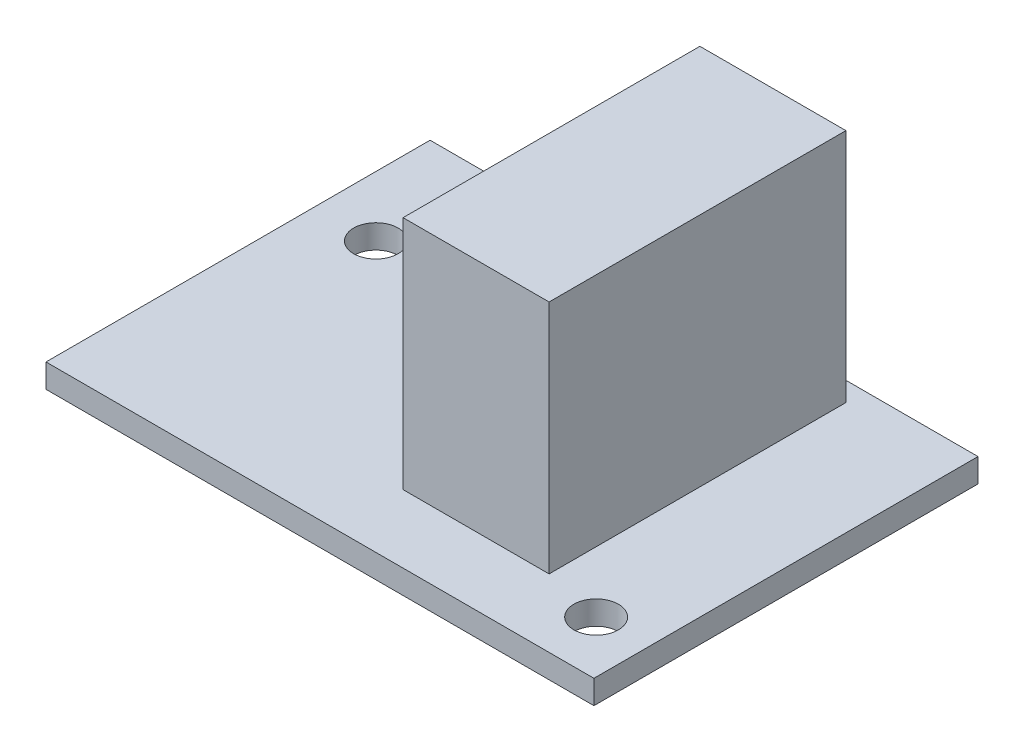
ISO-10303-21;
HEADER;
FILE_DESCRIPTION(('STEP AP214'),'2;1');
FILE_NAME('part.step','',(''),(''),'','','');
FILE_SCHEMA(('AUTOMOTIVE_DESIGN { 1 0 10303 214 1 1 1 1 }'));
ENDSEC;
DATA;
#1=APPLICATION_CONTEXT('core data for automotive mechanical design processes');
#2=APPLICATION_PROTOCOL_DEFINITION('international standard','automotive_design',2000,#1);
#3=PRODUCT_CONTEXT('',#1,'mechanical');
#4=PRODUCT('Part','Part','',(#3));
#5=PRODUCT_RELATED_PRODUCT_CATEGORY('part','',(#4));
#6=PRODUCT_DEFINITION_FORMATION('','',#4);
#7=PRODUCT_DEFINITION_CONTEXT('part definition',#1,'design');
#8=PRODUCT_DEFINITION('design','',#6,#7);
#9=PRODUCT_DEFINITION_SHAPE('','',#8);
#10=(LENGTH_UNIT() NAMED_UNIT(*) SI_UNIT(.MILLI.,.METRE.));
#11=(NAMED_UNIT(*) PLANE_ANGLE_UNIT() SI_UNIT($,.RADIAN.));
#12=(NAMED_UNIT(*) SI_UNIT($,.STERADIAN.) SOLID_ANGLE_UNIT());
#13=UNCERTAINTY_MEASURE_WITH_UNIT(LENGTH_MEASURE(1.E-05),#10,'distance_accuracy_value','');
#14=(GEOMETRIC_REPRESENTATION_CONTEXT(3) GLOBAL_UNCERTAINTY_ASSIGNED_CONTEXT((#13)) GLOBAL_UNIT_ASSIGNED_CONTEXT((#10,
#11,#12)) REPRESENTATION_CONTEXT('',''));
#15=CARTESIAN_POINT('',(0.,0.,0.));
#16=DIRECTION('',(0.,0.,1.));
#17=DIRECTION('',(1.,0.,0.));
#18=AXIS2_PLACEMENT_3D('',#15,#16,#17);
#19=CARTESIAN_POINT('',(0.,1.6,0.));
#20=DIRECTION('',(0.,-1.,0.));
#21=DIRECTION('',(0.,0.,-1.));
#22=AXIS2_PLACEMENT_3D('',#19,#20,#21);
#23=PLANE('',#22);
#24=CARTESIAN_POINT('',(4.05,1.6,-18.18));
#25=DIRECTION('',(0.,1.,0.));
#26=DIRECTION('',(0.,0.,1.));
#27=AXIS2_PLACEMENT_3D('',#24,#25,#26);
#28=CIRCLE('',#27,1.5);
#29=CARTESIAN_POINT('',(4.05,1.6,-16.68));
#30=VERTEX_POINT('',#29);
#31=EDGE_CURVE('E121',#30,#30,#28,.T.);
#32=ORIENTED_EDGE('',*,*,#31,.F.);
#33=EDGE_LOOP('',(#32));
#34=FACE_BOUND('',#33,.T.);
#35=CARTESIAN_POINT('',(33.42,1.6,-3.65));
#36=DIRECTION('',(0.,1.,0.));
#37=DIRECTION('',(0.,0.,1.));
#38=AXIS2_PLACEMENT_3D('',#35,#36,#37);
#39=CIRCLE('',#38,1.5);
#40=CARTESIAN_POINT('',(33.42,1.6,-2.15));
#41=VERTEX_POINT('',#40);
#42=EDGE_CURVE('E130',#41,#41,#39,.T.);
#43=ORIENTED_EDGE('',*,*,#42,.F.);
#44=EDGE_LOOP('',(#43));
#45=FACE_BOUND('',#44,.T.);
#46=DIRECTION('',(0.,0.,1.));
#47=VECTOR('',#46,1.);
#48=CARTESIAN_POINT('',(0.,1.6,0.));
#49=LINE('',#48,#47);
#50=CARTESIAN_POINT('',(0.,1.6,-25.88));
#51=VERTEX_POINT('',#50);
#52=CARTESIAN_POINT('',(0.,1.6,0.));
#53=VERTEX_POINT('',#52);
#54=EDGE_CURVE('E136',#51,#53,#49,.T.);
#55=ORIENTED_EDGE('',*,*,#54,.T.);
#56=DIRECTION('',(1.,0.,0.));
#57=VECTOR('',#56,1.);
#58=CARTESIAN_POINT('',(0.,1.6,0.));
#59=LINE('',#58,#57);
#60=CARTESIAN_POINT('',(36.92,1.6,0.));
#61=VERTEX_POINT('',#60);
#62=EDGE_CURVE('E139',#53,#61,#59,.T.);
#63=ORIENTED_EDGE('',*,*,#62,.T.);
#64=DIRECTION('',(0.,0.,-1.));
#65=VECTOR('',#64,1.);
#66=CARTESIAN_POINT('',(36.92,1.6,0.));
#67=LINE('',#66,#65);
#68=CARTESIAN_POINT('',(36.92,1.6,-25.88));
#69=VERTEX_POINT('',#68);
#70=EDGE_CURVE('E142',#61,#69,#67,.T.);
#71=ORIENTED_EDGE('',*,*,#70,.T.);
#72=DIRECTION('',(-1.,0.,0.));
#73=VECTOR('',#72,1.);
#74=CARTESIAN_POINT('',(0.,1.6,-25.88));
#75=LINE('',#74,#73);
#76=EDGE_CURVE('E144',#69,#51,#75,.T.);
#77=ORIENTED_EDGE('',*,*,#76,.T.);
#78=EDGE_LOOP('',(#55,#63,#71,#77));
#79=FACE_BOUND('',#78,.T.);
#80=DIRECTION('',(0.,0.,1.));
#81=VECTOR('',#80,1.);
#82=CARTESIAN_POINT('',(19.48,1.6,-24.58));
#83=LINE('',#82,#81);
#84=CARTESIAN_POINT('',(19.48,1.6,-24.58));
#85=VERTEX_POINT('',#84);
#86=CARTESIAN_POINT('',(19.48,1.6,-4.58));
#87=VERTEX_POINT('',#86);
#88=EDGE_CURVE('E117',#85,#87,#83,.T.);
#89=ORIENTED_EDGE('',*,*,#88,.F.);
#90=DIRECTION('',(-1.,0.,0.));
#91=VECTOR('',#90,1.);
#92=CARTESIAN_POINT('',(19.48,1.6,-24.58));
#93=LINE('',#92,#91);
#94=CARTESIAN_POINT('',(29.32,1.6,-24.58));
#95=VERTEX_POINT('',#94);
#96=EDGE_CURVE('E114',#95,#85,#93,.T.);
#97=ORIENTED_EDGE('',*,*,#96,.F.);
#98=DIRECTION('',(0.,0.,-1.));
#99=VECTOR('',#98,1.);
#100=CARTESIAN_POINT('',(29.32,1.6,-24.58));
#101=LINE('',#100,#99);
#102=CARTESIAN_POINT('',(29.32,1.6,-4.58));
#103=VERTEX_POINT('',#102);
#104=EDGE_CURVE('E52',#103,#95,#101,.T.);
#105=ORIENTED_EDGE('',*,*,#104,.F.);
#106=DIRECTION('',(1.,0.,0.));
#107=VECTOR('',#106,1.);
#108=CARTESIAN_POINT('',(19.48,1.6,-4.58));
#109=LINE('',#108,#107);
#110=EDGE_CURVE('E47',#87,#103,#109,.T.);
#111=ORIENTED_EDGE('',*,*,#110,.F.);
#112=EDGE_LOOP('',(#89,#97,#105,#111));
#113=FACE_BOUND('',#112,.T.);
#114=ADVANCED_FACE('F32',(#34,#45,#79,#113),#23,.F.);
#115=CARTESIAN_POINT('',(0.,0.,0.));
#116=DIRECTION('',(0.,-1.,0.));
#117=DIRECTION('',(0.,0.,-1.));
#118=AXIS2_PLACEMENT_3D('',#115,#116,#117);
#119=PLANE('',#118);
#120=CARTESIAN_POINT('',(33.42,0.,-3.65));
#121=DIRECTION('',(0.,1.,0.));
#122=DIRECTION('',(0.,0.,1.));
#123=AXIS2_PLACEMENT_3D('',#120,#121,#122);
#124=CIRCLE('',#123,1.5);
#125=CARTESIAN_POINT('',(33.42,0.,-2.15));
#126=VERTEX_POINT('',#125);
#127=EDGE_CURVE('E128',#126,#126,#124,.T.);
#128=ORIENTED_EDGE('',*,*,#127,.T.);
#129=EDGE_LOOP('',(#128));
#130=FACE_BOUND('',#129,.T.);
#131=DIRECTION('',(0.,0.,1.));
#132=VECTOR('',#131,1.);
#133=CARTESIAN_POINT('',(0.,0.,0.));
#134=LINE('',#133,#132);
#135=CARTESIAN_POINT('',(0.,0.,-25.88));
#136=VERTEX_POINT('',#135);
#137=CARTESIAN_POINT('',(0.,0.,0.));
#138=VERTEX_POINT('',#137);
#139=EDGE_CURVE('E133',#136,#138,#134,.T.);
#140=ORIENTED_EDGE('',*,*,#139,.F.);
#141=DIRECTION('',(-1.,0.,0.));
#142=VECTOR('',#141,1.);
#143=CARTESIAN_POINT('',(0.,0.,-25.88));
#144=LINE('',#143,#142);
#145=CARTESIAN_POINT('',(36.92,0.,-25.88));
#146=VERTEX_POINT('',#145);
#147=EDGE_CURVE('E140',#146,#136,#144,.T.);
#148=ORIENTED_EDGE('',*,*,#147,.F.);
#149=DIRECTION('',(0.,0.,-1.));
#150=VECTOR('',#149,1.);
#151=CARTESIAN_POINT('',(36.92,0.,0.));
#152=LINE('',#151,#150);
#153=CARTESIAN_POINT('',(36.92,0.,0.));
#154=VERTEX_POINT('',#153);
#155=EDGE_CURVE('E151',#154,#146,#152,.T.);
#156=ORIENTED_EDGE('',*,*,#155,.F.);
#157=DIRECTION('',(1.,0.,0.));
#158=VECTOR('',#157,1.);
#159=CARTESIAN_POINT('',(0.,0.,0.));
#160=LINE('',#159,#158);
#161=EDGE_CURVE('E149',#138,#154,#160,.T.);
#162=ORIENTED_EDGE('',*,*,#161,.F.);
#163=EDGE_LOOP('',(#140,#148,#156,#162));
#164=FACE_BOUND('',#163,.T.);
#165=CARTESIAN_POINT('',(4.05,0.,-18.18));
#166=DIRECTION('',(0.,1.,0.));
#167=DIRECTION('',(0.,0.,1.));
#168=AXIS2_PLACEMENT_3D('',#165,#166,#167);
#169=CIRCLE('',#168,1.5);
#170=CARTESIAN_POINT('',(4.05,0.,-16.68));
#171=VERTEX_POINT('',#170);
#172=EDGE_CURVE('E118',#171,#171,#169,.T.);
#173=ORIENTED_EDGE('',*,*,#172,.T.);
#174=EDGE_LOOP('',(#173));
#175=FACE_BOUND('',#174,.T.);
#176=ADVANCED_FACE('F169',(#130,#164,#175),#119,.T.);
#177=CARTESIAN_POINT('',(0.,1.6,0.));
#178=DIRECTION('',(1.,0.,0.));
#179=DIRECTION('',(0.,0.,-1.));
#180=AXIS2_PLACEMENT_3D('',#177,#178,#179);
#181=PLANE('',#180);
#182=ORIENTED_EDGE('',*,*,#139,.T.);
#183=DIRECTION('',(0.,-1.,0.));
#184=VECTOR('',#183,1.);
#185=CARTESIAN_POINT('',(0.,1.6,0.));
#186=LINE('',#185,#184);
#187=EDGE_CURVE('E11',#53,#138,#186,.T.);
#188=ORIENTED_EDGE('',*,*,#187,.F.);
#189=ORIENTED_EDGE('',*,*,#54,.F.);
#190=DIRECTION('',(0.,-1.,0.));
#191=VECTOR('',#190,1.);
#192=CARTESIAN_POINT('',(0.,1.6,-25.88));
#193=LINE('',#192,#191);
#194=EDGE_CURVE('E146',#51,#136,#193,.T.);
#195=ORIENTED_EDGE('',*,*,#194,.T.);
#196=EDGE_LOOP('',(#182,#188,#189,#195));
#197=FACE_BOUND('',#196,.T.);
#198=ADVANCED_FACE('F34',(#197),#181,.F.);
#199=CARTESIAN_POINT('',(0.,1.6,0.));
#200=DIRECTION('',(0.,0.,-1.));
#201=DIRECTION('',(-1.,0.,0.));
#202=AXIS2_PLACEMENT_3D('',#199,#200,#201);
#203=PLANE('',#202);
#204=ORIENTED_EDGE('',*,*,#161,.T.);
#205=DIRECTION('',(0.,-1.,0.));
#206=VECTOR('',#205,1.);
#207=CARTESIAN_POINT('',(36.92,1.6,0.));
#208=LINE('',#207,#206);
#209=EDGE_CURVE('E40',#61,#154,#208,.T.);
#210=ORIENTED_EDGE('',*,*,#209,.F.);
#211=ORIENTED_EDGE('',*,*,#62,.F.);
#212=ORIENTED_EDGE('',*,*,#187,.T.);
#213=EDGE_LOOP('',(#204,#210,#211,#212));
#214=FACE_BOUND('',#213,.T.);
#215=ADVANCED_FACE('F179',(#214),#203,.F.);
#216=CARTESIAN_POINT('',(36.92,1.6,0.));
#217=DIRECTION('',(-1.,0.,0.));
#218=DIRECTION('',(0.,0.,1.));
#219=AXIS2_PLACEMENT_3D('',#216,#217,#218);
#220=PLANE('',#219);
#221=ORIENTED_EDGE('',*,*,#155,.T.);
#222=DIRECTION('',(0.,-1.,0.));
#223=VECTOR('',#222,1.);
#224=CARTESIAN_POINT('',(36.92,1.6,-25.88));
#225=LINE('',#224,#223);
#226=EDGE_CURVE('E156',#69,#146,#225,.T.);
#227=ORIENTED_EDGE('',*,*,#226,.F.);
#228=ORIENTED_EDGE('',*,*,#70,.F.);
#229=ORIENTED_EDGE('',*,*,#209,.T.);
#230=EDGE_LOOP('',(#221,#227,#228,#229));
#231=FACE_BOUND('',#230,.T.);
#232=ADVANCED_FACE('F163',(#231),#220,.F.);
#233=CARTESIAN_POINT('',(0.,1.6,-25.88));
#234=DIRECTION('',(0.,0.,1.));
#235=DIRECTION('',(1.,0.,0.));
#236=AXIS2_PLACEMENT_3D('',#233,#234,#235);
#237=PLANE('',#236);
#238=ORIENTED_EDGE('',*,*,#147,.T.);
#239=ORIENTED_EDGE('',*,*,#194,.F.);
#240=ORIENTED_EDGE('',*,*,#76,.F.);
#241=ORIENTED_EDGE('',*,*,#226,.T.);
#242=EDGE_LOOP('',(#238,#239,#240,#241));
#243=FACE_BOUND('',#242,.T.);
#244=ADVANCED_FACE('F173',(#243),#237,.F.);
#245=CARTESIAN_POINT('',(33.42,1.6,-3.65));
#246=DIRECTION('',(0.,-1.,0.));
#247=DIRECTION('',(0.,0.,-1.));
#248=AXIS2_PLACEMENT_3D('',#245,#246,#247);
#249=CYLINDRICAL_SURFACE('',#248,1.5);
#250=ORIENTED_EDGE('',*,*,#42,.T.);
#251=EDGE_LOOP('',(#250));
#252=FACE_BOUND('',#251,.T.);
#253=ORIENTED_EDGE('',*,*,#127,.F.);
#254=EDGE_LOOP('',(#253));
#255=FACE_BOUND('',#254,.T.);
#256=ADVANCED_FACE('F197',(#252,#255),#249,.F.);
#257=CARTESIAN_POINT('',(4.05,1.6,-18.18));
#258=DIRECTION('',(0.,-1.,0.));
#259=DIRECTION('',(0.,0.,-1.));
#260=AXIS2_PLACEMENT_3D('',#257,#258,#259);
#261=CYLINDRICAL_SURFACE('',#260,1.5);
#262=ORIENTED_EDGE('',*,*,#31,.T.);
#263=EDGE_LOOP('',(#262));
#264=FACE_BOUND('',#263,.T.);
#265=ORIENTED_EDGE('',*,*,#172,.F.);
#266=EDGE_LOOP('',(#265));
#267=FACE_BOUND('',#266,.T.);
#268=ADVANCED_FACE('F204',(#264,#267),#261,.F.);
#269=CARTESIAN_POINT('',(19.48,17.47,-24.58));
#270=DIRECTION('',(1.,0.,0.));
#271=DIRECTION('',(0.,0.,-1.));
#272=AXIS2_PLACEMENT_3D('',#269,#270,#271);
#273=PLANE('',#272);
#274=ORIENTED_EDGE('',*,*,#88,.T.);
#275=DIRECTION('',(0.,-1.,0.));
#276=VECTOR('',#275,1.);
#277=CARTESIAN_POINT('',(19.48,17.47,-4.58));
#278=LINE('',#277,#276);
#279=CARTESIAN_POINT('',(19.48,17.47,-4.58));
#280=VERTEX_POINT('',#279);
#281=EDGE_CURVE('E98',#280,#87,#278,.T.);
#282=ORIENTED_EDGE('',*,*,#281,.F.);
#283=DIRECTION('',(0.,0.,1.));
#284=VECTOR('',#283,1.);
#285=CARTESIAN_POINT('',(19.48,17.47,-24.58));
#286=LINE('',#285,#284);
#287=CARTESIAN_POINT('',(19.48,17.47,-24.58));
#288=VERTEX_POINT('',#287);
#289=EDGE_CURVE('E105',#288,#280,#286,.T.);
#290=ORIENTED_EDGE('',*,*,#289,.F.);
#291=DIRECTION('',(0.,-1.,0.));
#292=VECTOR('',#291,1.);
#293=CARTESIAN_POINT('',(19.48,17.47,-24.58));
#294=LINE('',#293,#292);
#295=EDGE_CURVE('E300',#288,#85,#294,.T.);
#296=ORIENTED_EDGE('',*,*,#295,.T.);
#297=EDGE_LOOP('',(#274,#282,#290,#296));
#298=FACE_BOUND('',#297,.T.);
#299=ADVANCED_FACE('F116',(#298),#273,.F.);
#300=CARTESIAN_POINT('',(19.48,17.47,-4.58));
#301=DIRECTION('',(0.,0.,-1.));
#302=DIRECTION('',(-1.,0.,0.));
#303=AXIS2_PLACEMENT_3D('',#300,#301,#302);
#304=PLANE('',#303);
#305=ORIENTED_EDGE('',*,*,#110,.T.);
#306=DIRECTION('',(0.,-1.,0.));
#307=VECTOR('',#306,1.);
#308=CARTESIAN_POINT('',(29.32,17.47,-4.58));
#309=LINE('',#308,#307);
#310=CARTESIAN_POINT('',(29.32,17.47,-4.58));
#311=VERTEX_POINT('',#310);
#312=EDGE_CURVE('E101',#311,#103,#309,.T.);
#313=ORIENTED_EDGE('',*,*,#312,.F.);
#314=DIRECTION('',(1.,0.,0.));
#315=VECTOR('',#314,1.);
#316=CARTESIAN_POINT('',(19.48,17.47,-4.58));
#317=LINE('',#316,#315);
#318=EDGE_CURVE('E94',#280,#311,#317,.T.);
#319=ORIENTED_EDGE('',*,*,#318,.F.);
#320=ORIENTED_EDGE('',*,*,#281,.T.);
#321=EDGE_LOOP('',(#305,#313,#319,#320));
#322=FACE_BOUND('',#321,.T.);
#323=ADVANCED_FACE('F96',(#322),#304,.F.);
#324=CARTESIAN_POINT('',(29.32,17.47,-24.58));
#325=DIRECTION('',(-1.,0.,0.));
#326=DIRECTION('',(0.,0.,1.));
#327=AXIS2_PLACEMENT_3D('',#324,#325,#326);
#328=PLANE('',#327);
#329=ORIENTED_EDGE('',*,*,#104,.T.);
#330=DIRECTION('',(0.,-1.,0.));
#331=VECTOR('',#330,1.);
#332=CARTESIAN_POINT('',(29.32,17.47,-24.58));
#333=LINE('',#332,#331);
#334=CARTESIAN_POINT('',(29.32,17.47,-24.58));
#335=VERTEX_POINT('',#334);
#336=EDGE_CURVE('E123',#335,#95,#333,.T.);
#337=ORIENTED_EDGE('',*,*,#336,.F.);
#338=DIRECTION('',(0.,0.,-1.));
#339=VECTOR('',#338,1.);
#340=CARTESIAN_POINT('',(29.32,17.47,-24.58));
#341=LINE('',#340,#339);
#342=EDGE_CURVE('E104',#311,#335,#341,.T.);
#343=ORIENTED_EDGE('',*,*,#342,.F.);
#344=ORIENTED_EDGE('',*,*,#312,.T.);
#345=EDGE_LOOP('',(#329,#337,#343,#344));
#346=FACE_BOUND('',#345,.T.);
#347=ADVANCED_FACE('F221',(#346),#328,.F.);
#348=CARTESIAN_POINT('',(19.48,17.47,-24.58));
#349=DIRECTION('',(0.,0.,1.));
#350=DIRECTION('',(1.,0.,0.));
#351=AXIS2_PLACEMENT_3D('',#348,#349,#350);
#352=PLANE('',#351);
#353=ORIENTED_EDGE('',*,*,#96,.T.);
#354=ORIENTED_EDGE('',*,*,#295,.F.);
#355=DIRECTION('',(-1.,0.,0.));
#356=VECTOR('',#355,1.);
#357=CARTESIAN_POINT('',(19.48,17.47,-24.58));
#358=LINE('',#357,#356);
#359=EDGE_CURVE('E110',#335,#288,#358,.T.);
#360=ORIENTED_EDGE('',*,*,#359,.F.);
#361=ORIENTED_EDGE('',*,*,#336,.T.);
#362=EDGE_LOOP('',(#353,#354,#360,#361));
#363=FACE_BOUND('',#362,.T.);
#364=ADVANCED_FACE('F224',(#363),#352,.F.);
#365=CARTESIAN_POINT('',(0.,17.47,0.));
#366=DIRECTION('',(0.,1.,0.));
#367=DIRECTION('',(0.,0.,1.));
#368=AXIS2_PLACEMENT_3D('',#365,#366,#367);
#369=PLANE('',#368);
#370=ORIENTED_EDGE('',*,*,#289,.T.);
#371=ORIENTED_EDGE('',*,*,#318,.T.);
#372=ORIENTED_EDGE('',*,*,#342,.T.);
#373=ORIENTED_EDGE('',*,*,#359,.T.);
#374=EDGE_LOOP('',(#370,#371,#372,#373));
#375=FACE_BOUND('',#374,.T.);
#376=ADVANCED_FACE('F108',(#375),#369,.T.);
#377=CLOSED_SHELL('',(#114,#176,#198,#215,#232,#244,#256,#268,#299,#323,#347,#364,#376));
#378=MANIFOLD_SOLID_BREP('B2',#377);
#379=ADVANCED_BREP_SHAPE_REPRESENTATION('',(#18,#378),#14);
#380=SHAPE_DEFINITION_REPRESENTATION(#9,#379);
ENDSEC;
END-ISO-10303-21;
